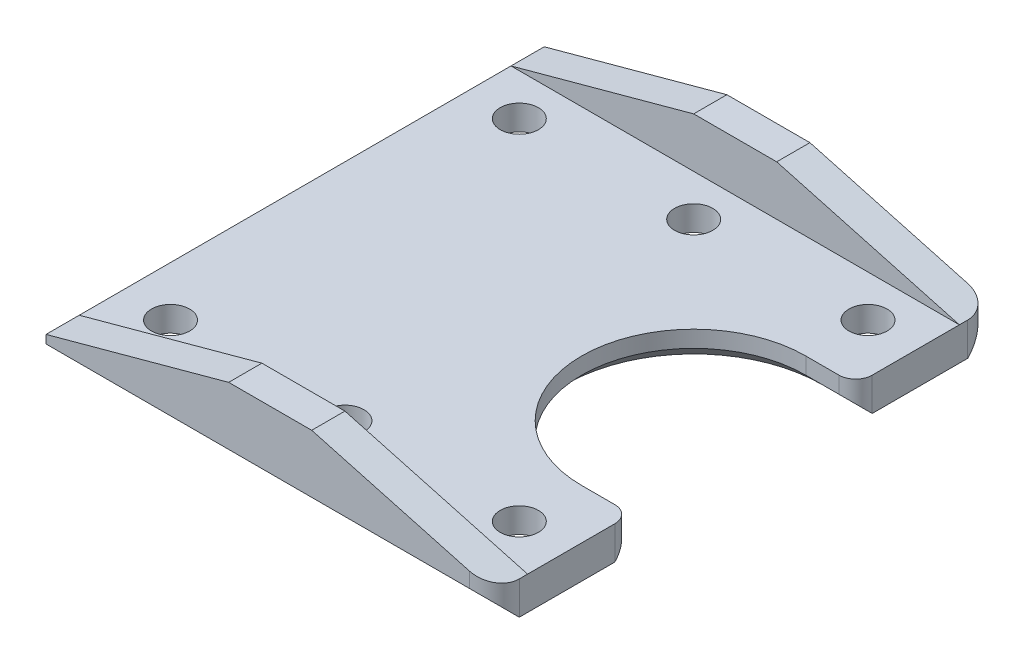
ISO-10303-21;
HEADER;
FILE_DESCRIPTION(('STEP AP214'),'2;1');
FILE_NAME('part.step','',(''),(''),'','','');
FILE_SCHEMA(('AUTOMOTIVE_DESIGN { 1 0 10303 214 1 1 1 1 }'));
ENDSEC;
DATA;
#1=APPLICATION_CONTEXT('core data for automotive mechanical design processes');
#2=APPLICATION_PROTOCOL_DEFINITION('international standard','automotive_design',2000,#1);
#3=PRODUCT_CONTEXT('',#1,'mechanical');
#4=PRODUCT('Part','Part','',(#3));
#5=PRODUCT_RELATED_PRODUCT_CATEGORY('part','',(#4));
#6=PRODUCT_DEFINITION_FORMATION('','',#4);
#7=PRODUCT_DEFINITION_CONTEXT('part definition',#1,'design');
#8=PRODUCT_DEFINITION('design','',#6,#7);
#9=PRODUCT_DEFINITION_SHAPE('','',#8);
#10=(LENGTH_UNIT() NAMED_UNIT(*) SI_UNIT(.MILLI.,.METRE.));
#11=(NAMED_UNIT(*) PLANE_ANGLE_UNIT() SI_UNIT($,.RADIAN.));
#12=(NAMED_UNIT(*) SI_UNIT($,.STERADIAN.) SOLID_ANGLE_UNIT());
#13=UNCERTAINTY_MEASURE_WITH_UNIT(LENGTH_MEASURE(1.E-05),#10,'distance_accuracy_value','');
#14=(GEOMETRIC_REPRESENTATION_CONTEXT(3) GLOBAL_UNCERTAINTY_ASSIGNED_CONTEXT((#13)) GLOBAL_UNIT_ASSIGNED_CONTEXT((#10,
#11,#12)) REPRESENTATION_CONTEXT('',''));
#15=CARTESIAN_POINT('',(0.,0.,0.));
#16=DIRECTION('',(0.,0.,1.));
#17=DIRECTION('',(1.,0.,0.));
#18=AXIS2_PLACEMENT_3D('',#15,#16,#17);
#19=CARTESIAN_POINT('',(27.,0.,15.));
#20=DIRECTION('',(0.,1.,0.));
#21=DIRECTION('',(0.,0.,1.));
#22=AXIS2_PLACEMENT_3D('',#19,#20,#21);
#23=PLANE('',#22);
#24=CARTESIAN_POINT('',(3.,0.,-10.5));
#25=DIRECTION('',(0.,-1.,0.));
#26=DIRECTION('',(0.,0.,-1.));
#27=AXIS2_PLACEMENT_3D('',#24,#25,#26);
#28=CIRCLE('',#27,1.9);
#29=CARTESIAN_POINT('',(3.,0.,-12.4));
#30=VERTEX_POINT('',#29);
#31=EDGE_CURVE('E255',#30,#30,#28,.T.);
#32=ORIENTED_EDGE('',*,*,#31,.F.);
#33=EDGE_LOOP('',(#32));
#34=FACE_BOUND('',#33,.T.);
#35=CARTESIAN_POINT('',(13.5,0.,-10.5));
#36=DIRECTION('',(0.,-1.,0.));
#37=DIRECTION('',(0.,0.,-1.));
#38=AXIS2_PLACEMENT_3D('',#35,#36,#37);
#39=CIRCLE('',#38,1.9);
#40=CARTESIAN_POINT('',(13.5,0.,-12.4));
#41=VERTEX_POINT('',#40);
#42=EDGE_CURVE('E268',#41,#41,#39,.T.);
#43=ORIENTED_EDGE('',*,*,#42,.F.);
#44=EDGE_LOOP('',(#43));
#45=FACE_BOUND('',#44,.T.);
#46=CARTESIAN_POINT('',(24.,0.,-10.5));
#47=DIRECTION('',(0.,-1.,0.));
#48=DIRECTION('',(0.,0.,-1.));
#49=AXIS2_PLACEMENT_3D('',#46,#47,#48);
#50=CIRCLE('',#49,1.9);
#51=CARTESIAN_POINT('',(24.,0.,-12.4));
#52=VERTEX_POINT('',#51);
#53=EDGE_CURVE('E280',#52,#52,#50,.T.);
#54=ORIENTED_EDGE('',*,*,#53,.F.);
#55=EDGE_LOOP('',(#54));
#56=FACE_BOUND('',#55,.T.);
#57=CARTESIAN_POINT('',(3.,0.,10.5));
#58=DIRECTION('',(0.,-1.,0.));
#59=DIRECTION('',(0.,0.,-1.));
#60=AXIS2_PLACEMENT_3D('',#57,#58,#59);
#61=CIRCLE('',#60,1.9);
#62=CARTESIAN_POINT('',(3.,0.,8.6));
#63=VERTEX_POINT('',#62);
#64=EDGE_CURVE('E354',#63,#63,#61,.T.);
#65=ORIENTED_EDGE('',*,*,#64,.F.);
#66=EDGE_LOOP('',(#65));
#67=FACE_BOUND('',#66,.T.);
#68=CARTESIAN_POINT('',(24.,0.,10.5));
#69=DIRECTION('',(0.,-1.,0.));
#70=DIRECTION('',(0.,0.,-1.));
#71=AXIS2_PLACEMENT_3D('',#68,#69,#70);
#72=CIRCLE('',#71,1.9);
#73=CARTESIAN_POINT('',(24.,0.,8.6));
#74=VERTEX_POINT('',#73);
#75=EDGE_CURVE('E304',#74,#74,#72,.T.);
#76=ORIENTED_EDGE('',*,*,#75,.F.);
#77=EDGE_LOOP('',(#76));
#78=FACE_BOUND('',#77,.T.);
#79=CARTESIAN_POINT('',(13.5,0.,10.5));
#80=DIRECTION('',(0.,-1.,0.));
#81=DIRECTION('',(0.,0.,-1.));
#82=AXIS2_PLACEMENT_3D('',#79,#80,#81);
#83=CIRCLE('',#82,1.9);
#84=CARTESIAN_POINT('',(13.5,0.,8.6));
#85=VERTEX_POINT('',#84);
#86=EDGE_CURVE('E292',#85,#85,#83,.T.);
#87=ORIENTED_EDGE('',*,*,#86,.F.);
#88=EDGE_LOOP('',(#87));
#89=FACE_BOUND('',#88,.T.);
#90=DIRECTION('',(0.,0.,1.));
#91=VECTOR('',#90,1.);
#92=CARTESIAN_POINT('',(0.,0.,-15.));
#93=LINE('',#92,#91);
#94=CARTESIAN_POINT('',(0.,0.,-13.5));
#95=VERTEX_POINT('',#94);
#96=CARTESIAN_POINT('',(0.,0.,13.5));
#97=VERTEX_POINT('',#96);
#98=EDGE_CURVE('E225',#95,#97,#93,.T.);
#99=ORIENTED_EDGE('',*,*,#98,.F.);
#100=DIRECTION('',(1.,0.,0.));
#101=VECTOR('',#100,1.);
#102=CARTESIAN_POINT('',(27.,0.,-13.5));
#103=LINE('',#102,#101);
#104=CARTESIAN_POINT('',(27.,0.,-13.5));
#105=VERTEX_POINT('',#104);
#106=EDGE_CURVE('E416',#95,#105,#103,.T.);
#107=ORIENTED_EDGE('',*,*,#106,.T.);
#108=DIRECTION('',(0.,0.,-1.));
#109=VECTOR('',#108,1.);
#110=CARTESIAN_POINT('',(27.,0.,15.));
#111=LINE('',#110,#109);
#112=CARTESIAN_POINT('',(27.,0.,-7.75000000000001));
#113=VERTEX_POINT('',#112);
#114=EDGE_CURVE('E327',#113,#105,#111,.T.);
#115=ORIENTED_EDGE('',*,*,#114,.F.);
#116=DIRECTION('',(-1.,0.,0.));
#117=VECTOR('',#116,1.);
#118=CARTESIAN_POINT('',(27.,0.,-7.75000000000001));
#119=LINE('',#118,#117);
#120=CARTESIAN_POINT('',(24.,0.,-7.75000000000001));
#121=VERTEX_POINT('',#120);
#122=EDGE_CURVE('E370',#113,#121,#119,.T.);
#123=ORIENTED_EDGE('',*,*,#122,.T.);
#124=CARTESIAN_POINT('',(24.,0.,0.));
#125=DIRECTION('',(0.,1.,0.));
#126=DIRECTION('',(0.,0.,1.));
#127=AXIS2_PLACEMENT_3D('',#124,#125,#126);
#128=CIRCLE('',#127,7.75000000000001);
#129=CARTESIAN_POINT('',(24.,0.,7.75000000000001));
#130=VERTEX_POINT('',#129);
#131=EDGE_CURVE('E368',#121,#130,#128,.T.);
#132=ORIENTED_EDGE('',*,*,#131,.T.);
#133=DIRECTION('',(1.,0.,0.));
#134=VECTOR('',#133,1.);
#135=CARTESIAN_POINT('',(27.,0.,7.75000000000001));
#136=LINE('',#135,#134);
#137=CARTESIAN_POINT('',(27.,0.,7.75000000000001));
#138=VERTEX_POINT('',#137);
#139=EDGE_CURVE('E372',#130,#138,#136,.T.);
#140=ORIENTED_EDGE('',*,*,#139,.T.);
#141=CARTESIAN_POINT('',(27.,0.,13.5));
#142=VERTEX_POINT('',#141);
#143=EDGE_CURVE('E330',#142,#138,#111,.T.);
#144=ORIENTED_EDGE('',*,*,#143,.F.);
#145=DIRECTION('',(-1.,0.,0.));
#146=VECTOR('',#145,1.);
#147=CARTESIAN_POINT('',(27.,0.,13.5));
#148=LINE('',#147,#146);
#149=EDGE_CURVE('E413',#142,#97,#148,.T.);
#150=ORIENTED_EDGE('',*,*,#149,.T.);
#151=EDGE_LOOP('',(#99,#107,#115,#123,#132,#140,#144,#150));
#152=FACE_BOUND('',#151,.T.);
#153=ADVANCED_FACE('F54',(#34,#45,#56,#67,#78,#89,#152),#23,.F.);
#154=CARTESIAN_POINT('',(27.,5.,15.));
#155=DIRECTION('',(0.,0.,-1.));
#156=DIRECTION('',(0.,1.,0.));
#157=AXIS2_PLACEMENT_3D('',#154,#155,#156);
#158=PLANE('',#157);
#159=DIRECTION('',(0.,-1.,0.));
#160=VECTOR('',#159,1.);
#161=CARTESIAN_POINT('',(0.,0.,15.));
#162=LINE('',#161,#160);
#163=CARTESIAN_POINT('',(0.,2.,15.));
#164=VERTEX_POINT('',#163);
#165=CARTESIAN_POINT('',(0.,1.50000000000001,15.));
#166=VERTEX_POINT('',#165);
#167=EDGE_CURVE('E220',#164,#166,#162,.T.);
#168=ORIENTED_EDGE('',*,*,#167,.T.);
#169=DIRECTION('',(1.,0.,0.));
#170=VECTOR('',#169,1.);
#171=CARTESIAN_POINT('',(27.,1.50000000000001,15.));
#172=LINE('',#171,#170);
#173=CARTESIAN_POINT('',(25.5,1.50000000000001,15.));
#174=VERTEX_POINT('',#173);
#175=EDGE_CURVE('E421',#166,#174,#172,.T.);
#176=ORIENTED_EDGE('',*,*,#175,.T.);
#177=DIRECTION('',(0.,-1.,0.));
#178=VECTOR('',#177,1.);
#179=CARTESIAN_POINT('',(25.5,5.,15.));
#180=LINE('',#179,#178);
#181=CARTESIAN_POINT('',(25.5,2.40909090909091,15.));
#182=VERTEX_POINT('',#181);
#183=EDGE_CURVE('E386',#174,#182,#180,.F.);
#184=ORIENTED_EDGE('',*,*,#183,.T.);
#185=DIRECTION('',(0.964763821237732,-0.263117405792109,0.));
#186=VECTOR('',#185,1.);
#187=CARTESIAN_POINT('',(16.,5.,15.));
#188=LINE('',#187,#186);
#189=CARTESIAN_POINT('',(16.,5.,15.));
#190=VERTEX_POINT('',#189);
#191=EDGE_CURVE('E77',#190,#182,#188,.T.);
#192=ORIENTED_EDGE('',*,*,#191,.F.);
#193=DIRECTION('',(-1.,0.,0.));
#194=VECTOR('',#193,1.);
#195=CARTESIAN_POINT('',(27.,5.,15.));
#196=LINE('',#195,#194);
#197=CARTESIAN_POINT('',(11.,5.,15.));
#198=VERTEX_POINT('',#197);
#199=EDGE_CURVE('E337',#190,#198,#196,.T.);
#200=ORIENTED_EDGE('',*,*,#199,.T.);
#201=DIRECTION('',(-0.964763821237732,-0.263117405792109,0.));
#202=VECTOR('',#201,1.);
#203=CARTESIAN_POINT('',(-0.507692307692307,1.86153846153846,15.));
#204=LINE('',#203,#202);
#205=EDGE_CURVE('E217',#198,#164,#204,.T.);
#206=ORIENTED_EDGE('',*,*,#205,.T.);
#207=EDGE_LOOP('',(#168,#176,#184,#192,#200,#206));
#208=FACE_BOUND('',#207,.T.);
#209=ADVANCED_FACE('F439',(#208),#158,.F.);
#210=CARTESIAN_POINT('',(27.,0.,-15.));
#211=DIRECTION('',(0.,0.,1.));
#212=DIRECTION('',(0.,-1.,0.));
#213=AXIS2_PLACEMENT_3D('',#210,#211,#212);
#214=PLANE('',#213);
#215=DIRECTION('',(0.,-1.,0.));
#216=VECTOR('',#215,1.);
#217=CARTESIAN_POINT('',(0.,0.,-15.));
#218=LINE('',#217,#216);
#219=CARTESIAN_POINT('',(0.,2.,-15.));
#220=VERTEX_POINT('',#219);
#221=CARTESIAN_POINT('',(0.,1.50000000000001,-15.));
#222=VERTEX_POINT('',#221);
#223=EDGE_CURVE('E203',#220,#222,#218,.T.);
#224=ORIENTED_EDGE('',*,*,#223,.F.);
#225=DIRECTION('',(-0.964763821237732,-0.263117405792109,0.));
#226=VECTOR('',#225,1.);
#227=CARTESIAN_POINT('',(-0.507692307692307,1.86153846153846,-15.));
#228=LINE('',#227,#226);
#229=CARTESIAN_POINT('',(11.,5.,-15.));
#230=VERTEX_POINT('',#229);
#231=EDGE_CURVE('E191',#230,#220,#228,.T.);
#232=ORIENTED_EDGE('',*,*,#231,.F.);
#233=DIRECTION('',(-1.,0.,0.));
#234=VECTOR('',#233,1.);
#235=CARTESIAN_POINT('',(27.,5.,-15.));
#236=LINE('',#235,#234);
#237=CARTESIAN_POINT('',(16.,5.,-15.));
#238=VERTEX_POINT('',#237);
#239=EDGE_CURVE('E352',#238,#230,#236,.T.);
#240=ORIENTED_EDGE('',*,*,#239,.F.);
#241=DIRECTION('',(0.964763821237732,-0.263117405792109,0.));
#242=VECTOR('',#241,1.);
#243=CARTESIAN_POINT('',(16.,5.,-15.));
#244=LINE('',#243,#242);
#245=CARTESIAN_POINT('',(25.5,2.40909090909091,-15.));
#246=VERTEX_POINT('',#245);
#247=EDGE_CURVE('E234',#238,#246,#244,.T.);
#248=ORIENTED_EDGE('',*,*,#247,.T.);
#249=DIRECTION('',(0.,1.,0.));
#250=VECTOR('',#249,1.);
#251=CARTESIAN_POINT('',(25.5,0.,-15.));
#252=LINE('',#251,#250);
#253=CARTESIAN_POINT('',(25.5,1.50000000000001,-15.));
#254=VERTEX_POINT('',#253);
#255=EDGE_CURVE('E380',#246,#254,#252,.F.);
#256=ORIENTED_EDGE('',*,*,#255,.T.);
#257=DIRECTION('',(-1.,0.,0.));
#258=VECTOR('',#257,1.);
#259=CARTESIAN_POINT('',(27.,1.50000000000001,-15.));
#260=LINE('',#259,#258);
#261=EDGE_CURVE('E216',#254,#222,#260,.T.);
#262=ORIENTED_EDGE('',*,*,#261,.T.);
#263=EDGE_LOOP('',(#224,#232,#240,#248,#256,#262));
#264=FACE_BOUND('',#263,.T.);
#265=ADVANCED_FACE('F214',(#264),#214,.F.);
#266=CARTESIAN_POINT('',(27.,5.,-15.));
#267=DIRECTION('',(0.,-1.,0.));
#268=DIRECTION('',(0.,0.,-1.));
#269=AXIS2_PLACEMENT_3D('',#266,#267,#268);
#270=PLANE('',#269);
#271=DIRECTION('',(0.,0.,1.));
#272=VECTOR('',#271,1.);
#273=CARTESIAN_POINT('',(11.,5.,-15.));
#274=LINE('',#273,#272);
#275=CARTESIAN_POINT('',(11.,5.,-13.));
#276=VERTEX_POINT('',#275);
#277=EDGE_CURVE('E197',#230,#276,#274,.T.);
#278=ORIENTED_EDGE('',*,*,#277,.T.);
#279=DIRECTION('',(-1.,0.,0.));
#280=VECTOR('',#279,1.);
#281=CARTESIAN_POINT('',(27.,5.,-13.));
#282=LINE('',#281,#280);
#283=CARTESIAN_POINT('',(16.,5.,-13.));
#284=VERTEX_POINT('',#283);
#285=EDGE_CURVE('E349',#284,#276,#282,.T.);
#286=ORIENTED_EDGE('',*,*,#285,.F.);
#287=DIRECTION('',(0.,0.,1.));
#288=VECTOR('',#287,1.);
#289=CARTESIAN_POINT('',(16.,5.,-15.));
#290=LINE('',#289,#288);
#291=EDGE_CURVE('E232',#238,#284,#290,.T.);
#292=ORIENTED_EDGE('',*,*,#291,.F.);
#293=ORIENTED_EDGE('',*,*,#239,.T.);
#294=EDGE_LOOP('',(#278,#286,#292,#293));
#295=FACE_BOUND('',#294,.T.);
#296=ADVANCED_FACE('F462',(#295),#270,.F.);
#297=CARTESIAN_POINT('',(27.,5.,-13.));
#298=DIRECTION('',(0.,0.,-1.));
#299=DIRECTION('',(-1.,0.,0.));
#300=AXIS2_PLACEMENT_3D('',#297,#298,#299);
#301=PLANE('',#300);
#302=DIRECTION('',(0.964763821237732,0.263117405792109,0.));
#303=VECTOR('',#302,1.);
#304=CARTESIAN_POINT('',(25.8923076923077,9.06153846153845,-13.));
#305=LINE('',#304,#303);
#306=CARTESIAN_POINT('',(0.,2.,-13.));
#307=VERTEX_POINT('',#306);
#308=EDGE_CURVE('E252',#307,#276,#305,.T.);
#309=ORIENTED_EDGE('',*,*,#308,.F.);
#310=DIRECTION('',(-1.,0.,0.));
#311=VECTOR('',#310,1.);
#312=CARTESIAN_POINT('',(27.,2.,-13.));
#313=LINE('',#312,#311);
#314=CARTESIAN_POINT('',(27.,2.,-13.));
#315=VERTEX_POINT('',#314);
#316=EDGE_CURVE('E346',#315,#307,#313,.T.);
#317=ORIENTED_EDGE('',*,*,#316,.F.);
#318=DIRECTION('',(-0.964763821237732,0.263117405792109,0.));
#319=VECTOR('',#318,1.);
#320=CARTESIAN_POINT('',(26.2384615384615,2.20769230769231,-13.));
#321=LINE('',#320,#319);
#322=EDGE_CURVE('E247',#315,#284,#321,.T.);
#323=ORIENTED_EDGE('',*,*,#322,.T.);
#324=ORIENTED_EDGE('',*,*,#285,.T.);
#325=EDGE_LOOP('',(#309,#317,#323,#324));
#326=FACE_BOUND('',#325,.T.);
#327=ADVANCED_FACE('F459',(#326),#301,.F.);
#328=CARTESIAN_POINT('',(27.,2.,-13.));
#329=DIRECTION('',(0.,-1.,0.));
#330=DIRECTION('',(0.,0.,-1.));
#331=AXIS2_PLACEMENT_3D('',#328,#329,#330);
#332=PLANE('',#331);
#333=CARTESIAN_POINT('',(3.,2.,10.5));
#334=DIRECTION('',(0.,-1.,0.));
#335=DIRECTION('',(0.,0.,-1.));
#336=AXIS2_PLACEMENT_3D('',#333,#334,#335);
#337=CIRCLE('',#336,1.15);
#338=CARTESIAN_POINT('',(3.,2.,9.35));
#339=VERTEX_POINT('',#338);
#340=EDGE_CURVE('E357',#339,#339,#337,.T.);
#341=ORIENTED_EDGE('',*,*,#340,.T.);
#342=EDGE_LOOP('',(#341));
#343=FACE_BOUND('',#342,.T.);
#344=CARTESIAN_POINT('',(24.,2.,10.5));
#345=DIRECTION('',(0.,-1.,0.));
#346=DIRECTION('',(0.,0.,-1.));
#347=AXIS2_PLACEMENT_3D('',#344,#345,#346);
#348=CIRCLE('',#347,1.15);
#349=CARTESIAN_POINT('',(24.,2.,9.35));
#350=VERTEX_POINT('',#349);
#351=EDGE_CURVE('E313',#350,#350,#348,.T.);
#352=ORIENTED_EDGE('',*,*,#351,.T.);
#353=EDGE_LOOP('',(#352));
#354=FACE_BOUND('',#353,.T.);
#355=CARTESIAN_POINT('',(13.5,2.,10.5));
#356=DIRECTION('',(0.,-1.,0.));
#357=DIRECTION('',(0.,0.,-1.));
#358=AXIS2_PLACEMENT_3D('',#355,#356,#357);
#359=CIRCLE('',#358,1.15);
#360=CARTESIAN_POINT('',(13.5,2.,9.35));
#361=VERTEX_POINT('',#360);
#362=EDGE_CURVE('E295',#361,#361,#359,.T.);
#363=ORIENTED_EDGE('',*,*,#362,.T.);
#364=EDGE_LOOP('',(#363));
#365=FACE_BOUND('',#364,.T.);
#366=CARTESIAN_POINT('',(24.,2.,-10.5));
#367=DIRECTION('',(0.,-1.,0.));
#368=DIRECTION('',(0.,0.,-1.));
#369=AXIS2_PLACEMENT_3D('',#366,#367,#368);
#370=CIRCLE('',#369,1.15);
#371=CARTESIAN_POINT('',(24.,2.,-11.65));
#372=VERTEX_POINT('',#371);
#373=EDGE_CURVE('E289',#372,#372,#370,.T.);
#374=ORIENTED_EDGE('',*,*,#373,.T.);
#375=EDGE_LOOP('',(#374));
#376=FACE_BOUND('',#375,.T.);
#377=CARTESIAN_POINT('',(13.5,2.,-10.5));
#378=DIRECTION('',(0.,-1.,0.));
#379=DIRECTION('',(0.,0.,-1.));
#380=AXIS2_PLACEMENT_3D('',#377,#378,#379);
#381=CIRCLE('',#380,1.15);
#382=CARTESIAN_POINT('',(13.5,2.,-11.65));
#383=VERTEX_POINT('',#382);
#384=EDGE_CURVE('E277',#383,#383,#381,.T.);
#385=ORIENTED_EDGE('',*,*,#384,.T.);
#386=EDGE_LOOP('',(#385));
#387=FACE_BOUND('',#386,.T.);
#388=CARTESIAN_POINT('',(3.,2.,-10.5));
#389=DIRECTION('',(0.,-1.,0.));
#390=DIRECTION('',(0.,0.,-1.));
#391=AXIS2_PLACEMENT_3D('',#388,#389,#390);
#392=CIRCLE('',#391,1.15);
#393=CARTESIAN_POINT('',(3.,2.,-11.65));
#394=VERTEX_POINT('',#393);
#395=EDGE_CURVE('E265',#394,#394,#392,.T.);
#396=ORIENTED_EDGE('',*,*,#395,.T.);
#397=EDGE_LOOP('',(#396));
#398=FACE_BOUND('',#397,.T.);
#399=DIRECTION('',(0.,0.,1.));
#400=VECTOR('',#399,1.);
#401=CARTESIAN_POINT('',(0.,2.,-15.));
#402=LINE('',#401,#400);
#403=CARTESIAN_POINT('',(0.,2.,13.));
#404=VERTEX_POINT('',#403);
#405=EDGE_CURVE('E210',#307,#404,#402,.T.);
#406=ORIENTED_EDGE('',*,*,#405,.T.);
#407=DIRECTION('',(-1.,0.,0.));
#408=VECTOR('',#407,1.);
#409=CARTESIAN_POINT('',(27.,2.,13.));
#410=LINE('',#409,#408);
#411=CARTESIAN_POINT('',(27.,2.,13.));
#412=VERTEX_POINT('',#411);
#413=EDGE_CURVE('E343',#412,#404,#410,.T.);
#414=ORIENTED_EDGE('',*,*,#413,.F.);
#415=DIRECTION('',(0.,0.,1.));
#416=VECTOR('',#415,1.);
#417=CARTESIAN_POINT('',(27.,2.,-13.));
#418=LINE('',#417,#416);
#419=CARTESIAN_POINT('',(27.,2.,7.74999999999999));
#420=VERTEX_POINT('',#419);
#421=EDGE_CURVE('E333',#420,#412,#418,.T.);
#422=ORIENTED_EDGE('',*,*,#421,.F.);
#423=CARTESIAN_POINT('',(26.,2.,7.75));
#424=DIRECTION('',(0.,-1.,0.));
#425=DIRECTION('',(0.,0.,-1.));
#426=AXIS2_PLACEMENT_3D('',#423,#424,#425);
#427=CIRCLE('',#426,1.);
#428=CARTESIAN_POINT('',(26.,2.,6.75));
#429=VERTEX_POINT('',#428);
#430=EDGE_CURVE('E394',#420,#429,#427,.F.);
#431=ORIENTED_EDGE('',*,*,#430,.T.);
#432=DIRECTION('',(1.,0.,0.));
#433=VECTOR('',#432,1.);
#434=CARTESIAN_POINT('',(28.,2.,6.75));
#435=LINE('',#434,#433);
#436=CARTESIAN_POINT('',(24.,2.,6.75));
#437=VERTEX_POINT('',#436);
#438=EDGE_CURVE('E316',#437,#429,#435,.T.);
#439=ORIENTED_EDGE('',*,*,#438,.F.);
#440=CARTESIAN_POINT('',(24.,2.,0.));
#441=DIRECTION('',(0.,1.,0.));
#442=DIRECTION('',(0.,0.,1.));
#443=AXIS2_PLACEMENT_3D('',#440,#441,#442);
#444=CIRCLE('',#443,6.75);
#445=CARTESIAN_POINT('',(24.,2.,-6.75));
#446=VERTEX_POINT('',#445);
#447=EDGE_CURVE('E321',#446,#437,#444,.T.);
#448=ORIENTED_EDGE('',*,*,#447,.F.);
#449=DIRECTION('',(-1.,0.,0.));
#450=VECTOR('',#449,1.);
#451=CARTESIAN_POINT('',(24.,2.,-6.75));
#452=LINE('',#451,#450);
#453=CARTESIAN_POINT('',(26.,2.,-6.75));
#454=VERTEX_POINT('',#453);
#455=EDGE_CURVE('E319',#454,#446,#452,.T.);
#456=ORIENTED_EDGE('',*,*,#455,.F.);
#457=CARTESIAN_POINT('',(26.,2.,-7.75));
#458=DIRECTION('',(0.,-1.,0.));
#459=DIRECTION('',(0.,0.,-1.));
#460=AXIS2_PLACEMENT_3D('',#457,#458,#459);
#461=CIRCLE('',#460,1.);
#462=CARTESIAN_POINT('',(27.,2.,-7.75));
#463=VERTEX_POINT('',#462);
#464=EDGE_CURVE('E396',#454,#463,#461,.F.);
#465=ORIENTED_EDGE('',*,*,#464,.T.);
#466=EDGE_CURVE('E334',#315,#463,#418,.T.);
#467=ORIENTED_EDGE('',*,*,#466,.F.);
#468=ORIENTED_EDGE('',*,*,#316,.T.);
#469=EDGE_LOOP('',(#406,#414,#422,#431,#439,#448,#456,#465,#467,#468));
#470=FACE_BOUND('',#469,.T.);
#471=ADVANCED_FACE('F454',(#343,#354,#365,#376,#387,#398,#470),#332,.F.);
#472=CARTESIAN_POINT('',(27.,2.,13.));
#473=DIRECTION('',(0.,0.,1.));
#474=DIRECTION('',(1.,0.,0.));
#475=AXIS2_PLACEMENT_3D('',#472,#473,#474);
#476=PLANE('',#475);
#477=DIRECTION('',(-0.964763821237732,-0.263117405792109,0.));
#478=VECTOR('',#477,1.);
#479=CARTESIAN_POINT('',(25.1307692307692,8.85384615384615,13.));
#480=LINE('',#479,#478);
#481=CARTESIAN_POINT('',(11.,5.,13.));
#482=VERTEX_POINT('',#481);
#483=EDGE_CURVE('E250',#482,#404,#480,.T.);
#484=ORIENTED_EDGE('',*,*,#483,.F.);
#485=DIRECTION('',(-1.,0.,0.));
#486=VECTOR('',#485,1.);
#487=CARTESIAN_POINT('',(27.,5.,13.));
#488=LINE('',#487,#486);
#489=CARTESIAN_POINT('',(16.,5.,13.));
#490=VERTEX_POINT('',#489);
#491=EDGE_CURVE('E340',#490,#482,#488,.T.);
#492=ORIENTED_EDGE('',*,*,#491,.F.);
#493=DIRECTION('',(0.964763821237732,-0.263117405792109,0.));
#494=VECTOR('',#493,1.);
#495=CARTESIAN_POINT('',(27.,2.,13.));
#496=LINE('',#495,#494);
#497=EDGE_CURVE('E244',#490,#412,#496,.T.);
#498=ORIENTED_EDGE('',*,*,#497,.T.);
#499=ORIENTED_EDGE('',*,*,#413,.T.);
#500=EDGE_LOOP('',(#484,#492,#498,#499));
#501=FACE_BOUND('',#500,.T.);
#502=ADVANCED_FACE('F450',(#501),#476,.F.);
#503=CARTESIAN_POINT('',(27.,5.,13.));
#504=DIRECTION('',(0.,-1.,0.));
#505=DIRECTION('',(0.,0.,-1.));
#506=AXIS2_PLACEMENT_3D('',#503,#504,#505);
#507=PLANE('',#506);
#508=EDGE_CURVE('E211',#482,#198,#274,.T.);
#509=ORIENTED_EDGE('',*,*,#508,.T.);
#510=ORIENTED_EDGE('',*,*,#199,.F.);
#511=EDGE_CURVE('E238',#490,#190,#290,.T.);
#512=ORIENTED_EDGE('',*,*,#511,.F.);
#513=ORIENTED_EDGE('',*,*,#491,.T.);
#514=EDGE_LOOP('',(#509,#510,#512,#513));
#515=FACE_BOUND('',#514,.T.);
#516=ADVANCED_FACE('F446',(#515),#507,.F.);
#517=CARTESIAN_POINT('',(27.,1.50000000000001,-15.));
#518=DIRECTION('',(0.,0.707106781186549,0.707106781186546));
#519=DIRECTION('',(-1.,0.,0.));
#520=AXIS2_PLACEMENT_3D('',#517,#518,#519);
#521=PLANE('',#520);
#522=ORIENTED_EDGE('',*,*,#106,.F.);
#523=DIRECTION('',(0.,-0.707106781186546,0.707106781186549));
#524=VECTOR('',#523,1.);
#525=CARTESIAN_POINT('',(0.,1.5,-15.));
#526=LINE('',#525,#524);
#527=EDGE_CURVE('E227',#95,#222,#526,.F.);
#528=ORIENTED_EDGE('',*,*,#527,.T.);
#529=ORIENTED_EDGE('',*,*,#261,.F.);
#530=CARTESIAN_POINT('',(25.5,0.,-13.5));
#531=DIRECTION('',(0.,0.707106781186549,0.707106781186546));
#532=DIRECTION('',(0.,-0.707106781186546,0.707106781186549));
#533=AXIS2_PLACEMENT_3D('',#530,#531,#532);
#534=ELLIPSE('',#533,2.12132034355964,1.5);
#535=EDGE_CURVE('E418',#105,#254,#534,.T.);
#536=ORIENTED_EDGE('',*,*,#535,.F.);
#537=EDGE_LOOP('',(#522,#528,#529,#536));
#538=FACE_BOUND('',#537,.T.);
#539=ADVANCED_FACE('F471',(#538),#521,.F.);
#540=CARTESIAN_POINT('',(27.,0.,13.5));
#541=DIRECTION('',(0.,0.707106781186546,-0.707106781186549));
#542=DIRECTION('',(-1.,0.,0.));
#543=AXIS2_PLACEMENT_3D('',#540,#541,#542);
#544=PLANE('',#543);
#545=ORIENTED_EDGE('',*,*,#175,.F.);
#546=DIRECTION('',(0.,0.707106781186549,0.707106781186546));
#547=VECTOR('',#546,1.);
#548=CARTESIAN_POINT('',(0.,0.,13.5));
#549=LINE('',#548,#547);
#550=EDGE_CURVE('E12',#166,#97,#549,.F.);
#551=ORIENTED_EDGE('',*,*,#550,.T.);
#552=ORIENTED_EDGE('',*,*,#149,.F.);
#553=CARTESIAN_POINT('',(25.5,0.,13.5));
#554=DIRECTION('',(0.,0.707106781186546,-0.707106781186549));
#555=DIRECTION('',(0.,0.707106781186549,0.707106781186546));
#556=AXIS2_PLACEMENT_3D('',#553,#554,#555);
#557=ELLIPSE('',#556,2.12132034355965,1.5);
#558=EDGE_CURVE('E62',#174,#142,#557,.T.);
#559=ORIENTED_EDGE('',*,*,#558,.F.);
#560=EDGE_LOOP('',(#545,#551,#552,#559));
#561=FACE_BOUND('',#560,.T.);
#562=ADVANCED_FACE('F56',(#561),#544,.F.);
#563=CARTESIAN_POINT('',(3.,0.,10.5));
#564=DIRECTION('',(0.,-1.,0.));
#565=DIRECTION('',(0.,0.,-1.));
#566=AXIS2_PLACEMENT_3D('',#563,#564,#565);
#567=CYLINDRICAL_SURFACE('',#566,1.9);
#568=CARTESIAN_POINT('',(3.,0.499999999999998,10.5));
#569=DIRECTION('',(0.,-1.,0.));
#570=DIRECTION('',(0.,0.,-1.));
#571=AXIS2_PLACEMENT_3D('',#568,#569,#570);
#572=CIRCLE('',#571,1.9);
#573=CARTESIAN_POINT('',(3.,0.499999999999998,8.6));
#574=VERTEX_POINT('',#573);
#575=EDGE_CURVE('E363',#574,#574,#572,.T.);
#576=ORIENTED_EDGE('',*,*,#575,.F.);
#577=EDGE_LOOP('',(#576));
#578=FACE_BOUND('',#577,.T.);
#579=ORIENTED_EDGE('',*,*,#64,.T.);
#580=EDGE_LOOP('',(#579));
#581=FACE_BOUND('',#580,.T.);
#582=ADVANCED_FACE('F538',(#578,#581),#567,.F.);
#583=CARTESIAN_POINT('',(4.15,0.499999999999998,10.5));
#584=DIRECTION('',(0.,1.,0.));
#585=DIRECTION('',(0.,0.,1.));
#586=AXIS2_PLACEMENT_3D('',#583,#584,#585);
#587=PLANE('',#586);
#588=CARTESIAN_POINT('',(3.,0.499999999999998,10.5));
#589=DIRECTION('',(0.,-1.,0.));
#590=DIRECTION('',(0.,0.,-1.));
#591=AXIS2_PLACEMENT_3D('',#588,#589,#590);
#592=CIRCLE('',#591,1.15);
#593=CARTESIAN_POINT('',(3.,0.499999999999998,9.35));
#594=VERTEX_POINT('',#593);
#595=EDGE_CURVE('E360',#594,#594,#592,.T.);
#596=ORIENTED_EDGE('',*,*,#595,.F.);
#597=EDGE_LOOP('',(#596));
#598=FACE_BOUND('',#597,.T.);
#599=ORIENTED_EDGE('',*,*,#575,.T.);
#600=EDGE_LOOP('',(#599));
#601=FACE_BOUND('',#600,.T.);
#602=ADVANCED_FACE('F534',(#598,#601),#587,.F.);
#603=CARTESIAN_POINT('',(3.,0.,10.5));
#604=DIRECTION('',(0.,-1.,0.));
#605=DIRECTION('',(0.,0.,-1.));
#606=AXIS2_PLACEMENT_3D('',#603,#604,#605);
#607=CYLINDRICAL_SURFACE('',#606,1.15);
#608=ORIENTED_EDGE('',*,*,#340,.F.);
#609=EDGE_LOOP('',(#608));
#610=FACE_BOUND('',#609,.T.);
#611=ORIENTED_EDGE('',*,*,#595,.T.);
#612=EDGE_LOOP('',(#611));
#613=FACE_BOUND('',#612,.T.);
#614=ADVANCED_FACE('F530',(#610,#613),#607,.F.);
#615=CARTESIAN_POINT('',(27.,0.,0.));
#616=DIRECTION('',(1.,0.,0.));
#617=DIRECTION('',(0.,0.,-1.));
#618=AXIS2_PLACEMENT_3D('',#615,#616,#617);
#619=PLANE('',#618);
#620=DIRECTION('',(0.,0.,1.));
#621=VECTOR('',#620,1.);
#622=CARTESIAN_POINT('',(27.,2.,-15.));
#623=LINE('',#622,#621);
#624=CARTESIAN_POINT('',(27.,2.,13.5));
#625=VERTEX_POINT('',#624);
#626=EDGE_CURVE('E229',#412,#625,#623,.T.);
#627=ORIENTED_EDGE('',*,*,#626,.T.);
#628=DIRECTION('',(0.,-1.,0.));
#629=VECTOR('',#628,1.);
#630=CARTESIAN_POINT('',(27.,0.,13.5));
#631=LINE('',#630,#629);
#632=EDGE_CURVE('E392',#625,#142,#631,.T.);
#633=ORIENTED_EDGE('',*,*,#632,.T.);
#634=ORIENTED_EDGE('',*,*,#143,.T.);
#635=DIRECTION('',(0.,1.,0.));
#636=VECTOR('',#635,1.);
#637=CARTESIAN_POINT('',(27.,2.,7.75));
#638=LINE('',#637,#636);
#639=EDGE_CURVE('E405',#138,#420,#638,.T.);
#640=ORIENTED_EDGE('',*,*,#639,.T.);
#641=ORIENTED_EDGE('',*,*,#421,.T.);
#642=EDGE_LOOP('',(#627,#633,#634,#640,#641));
#643=FACE_BOUND('',#642,.T.);
#644=ADVANCED_FACE('F533',(#643),#619,.T.);
#645=CARTESIAN_POINT('',(27.,2.,-13.5));
#646=VERTEX_POINT('',#645);
#647=EDGE_CURVE('E69',#646,#315,#623,.T.);
#648=ORIENTED_EDGE('',*,*,#647,.T.);
#649=ORIENTED_EDGE('',*,*,#466,.T.);
#650=DIRECTION('',(0.,-1.,0.));
#651=VECTOR('',#650,1.);
#652=CARTESIAN_POINT('',(27.,1.00000000000001,-7.75));
#653=LINE('',#652,#651);
#654=EDGE_CURVE('E398',#463,#113,#653,.T.);
#655=ORIENTED_EDGE('',*,*,#654,.T.);
#656=ORIENTED_EDGE('',*,*,#114,.T.);
#657=DIRECTION('',(0.,1.,0.));
#658=VECTOR('',#657,1.);
#659=CARTESIAN_POINT('',(27.,5.,-13.5));
#660=LINE('',#659,#658);
#661=EDGE_CURVE('E389',#105,#646,#660,.T.);
#662=ORIENTED_EDGE('',*,*,#661,.T.);
#663=EDGE_LOOP('',(#648,#649,#655,#656,#662));
#664=FACE_BOUND('',#663,.T.);
#665=ADVANCED_FACE('F476',(#664),#619,.T.);
#666=CARTESIAN_POINT('',(28.,-0.00100000000000013,6.75));
#667=DIRECTION('',(0.,0.,1.));
#668=DIRECTION('',(1.,0.,0.));
#669=AXIS2_PLACEMENT_3D('',#666,#667,#668);
#670=PLANE('',#669);
#671=ORIENTED_EDGE('',*,*,#438,.T.);
#672=DIRECTION('',(0.,1.,0.));
#673=VECTOR('',#672,1.);
#674=CARTESIAN_POINT('',(26.,1.,6.75));
#675=LINE('',#674,#673);
#676=CARTESIAN_POINT('',(26.,1.,6.75));
#677=VERTEX_POINT('',#676);
#678=EDGE_CURVE('E408',#429,#677,#675,.F.);
#679=ORIENTED_EDGE('',*,*,#678,.T.);
#680=DIRECTION('',(-1.,0.,0.));
#681=VECTOR('',#680,1.);
#682=CARTESIAN_POINT('',(28.,1.,6.75));
#683=LINE('',#682,#681);
#684=CARTESIAN_POINT('',(24.,1.,6.75));
#685=VERTEX_POINT('',#684);
#686=EDGE_CURVE('E366',#677,#685,#683,.T.);
#687=ORIENTED_EDGE('',*,*,#686,.T.);
#688=DIRECTION('',(0.,1.,0.));
#689=VECTOR('',#688,1.);
#690=CARTESIAN_POINT('',(24.,-0.00100000000000013,6.75));
#691=LINE('',#690,#689);
#692=EDGE_CURVE('E325',#685,#437,#691,.T.);
#693=ORIENTED_EDGE('',*,*,#692,.T.);
#694=EDGE_LOOP('',(#671,#679,#687,#693));
#695=FACE_BOUND('',#694,.T.);
#696=ADVANCED_FACE('F498',(#695),#670,.F.);
#697=CARTESIAN_POINT('',(24.,-0.00100000000000013,0.));
#698=DIRECTION('',(0.,1.,0.));
#699=DIRECTION('',(0.,0.,1.));
#700=AXIS2_PLACEMENT_3D('',#697,#698,#699);
#701=CYLINDRICAL_SURFACE('',#700,6.75);
#702=ORIENTED_EDGE('',*,*,#692,.F.);
#703=CARTESIAN_POINT('',(24.,1.,0.));
#704=DIRECTION('',(0.,1.,0.));
#705=DIRECTION('',(0.,0.,1.));
#706=AXIS2_PLACEMENT_3D('',#703,#704,#705);
#707=CIRCLE('',#706,6.75);
#708=CARTESIAN_POINT('',(24.,1.,-6.75));
#709=VERTEX_POINT('',#708);
#710=EDGE_CURVE('E378',#685,#709,#707,.F.);
#711=ORIENTED_EDGE('',*,*,#710,.T.);
#712=DIRECTION('',(0.,1.,0.));
#713=VECTOR('',#712,1.);
#714=CARTESIAN_POINT('',(24.,-0.00100000000000013,-6.75));
#715=LINE('',#714,#713);
#716=EDGE_CURVE('E324',#709,#446,#715,.T.);
#717=ORIENTED_EDGE('',*,*,#716,.T.);
#718=ORIENTED_EDGE('',*,*,#447,.T.);
#719=EDGE_LOOP('',(#702,#711,#717,#718));
#720=FACE_BOUND('',#719,.T.);
#721=ADVANCED_FACE('F493',(#720),#701,.F.);
#722=CARTESIAN_POINT('',(24.,-0.00100000000000013,-6.75));
#723=DIRECTION('',(0.,0.,-1.));
#724=DIRECTION('',(-1.,0.,0.));
#725=AXIS2_PLACEMENT_3D('',#722,#723,#724);
#726=PLANE('',#725);
#727=DIRECTION('',(1.,0.,0.));
#728=VECTOR('',#727,1.);
#729=CARTESIAN_POINT('',(24.,1.00000000000001,-6.75));
#730=LINE('',#729,#728);
#731=CARTESIAN_POINT('',(26.,1.00000000000001,-6.75));
#732=VERTEX_POINT('',#731);
#733=EDGE_CURVE('E375',#709,#732,#730,.T.);
#734=ORIENTED_EDGE('',*,*,#733,.T.);
#735=DIRECTION('',(0.,-1.,0.));
#736=VECTOR('',#735,1.);
#737=CARTESIAN_POINT('',(26.,2.,-6.75));
#738=LINE('',#737,#736);
#739=EDGE_CURVE('E403',#732,#454,#738,.F.);
#740=ORIENTED_EDGE('',*,*,#739,.T.);
#741=ORIENTED_EDGE('',*,*,#455,.T.);
#742=ORIENTED_EDGE('',*,*,#716,.F.);
#743=EDGE_LOOP('',(#734,#740,#741,#742));
#744=FACE_BOUND('',#743,.T.);
#745=ADVANCED_FACE('F488',(#744),#726,.F.);
#746=CARTESIAN_POINT('',(24.,0.,10.5));
#747=DIRECTION('',(0.,-1.,0.));
#748=DIRECTION('',(0.,0.,-1.));
#749=AXIS2_PLACEMENT_3D('',#746,#747,#748);
#750=CYLINDRICAL_SURFACE('',#749,1.15);
#751=ORIENTED_EDGE('',*,*,#351,.F.);
#752=EDGE_LOOP('',(#751));
#753=FACE_BOUND('',#752,.T.);
#754=CARTESIAN_POINT('',(24.,0.499999999999998,10.5));
#755=DIRECTION('',(0.,-1.,0.));
#756=DIRECTION('',(0.,0.,-1.));
#757=AXIS2_PLACEMENT_3D('',#754,#755,#756);
#758=CIRCLE('',#757,1.15);
#759=CARTESIAN_POINT('',(24.,0.499999999999998,9.35));
#760=VERTEX_POINT('',#759);
#761=EDGE_CURVE('E310',#760,#760,#758,.T.);
#762=ORIENTED_EDGE('',*,*,#761,.T.);
#763=EDGE_LOOP('',(#762));
#764=FACE_BOUND('',#763,.T.);
#765=ADVANCED_FACE('F583',(#753,#764),#750,.F.);
#766=CARTESIAN_POINT('',(25.15,0.499999999999998,10.5));
#767=DIRECTION('',(0.,1.,0.));
#768=DIRECTION('',(0.,0.,1.));
#769=AXIS2_PLACEMENT_3D('',#766,#767,#768);
#770=PLANE('',#769);
#771=ORIENTED_EDGE('',*,*,#761,.F.);
#772=EDGE_LOOP('',(#771));
#773=FACE_BOUND('',#772,.T.);
#774=CARTESIAN_POINT('',(24.,0.499999999999998,10.5));
#775=DIRECTION('',(0.,-1.,0.));
#776=DIRECTION('',(0.,0.,-1.));
#777=AXIS2_PLACEMENT_3D('',#774,#775,#776);
#778=CIRCLE('',#777,1.9);
#779=CARTESIAN_POINT('',(24.,0.499999999999998,8.6));
#780=VERTEX_POINT('',#779);
#781=EDGE_CURVE('E307',#780,#780,#778,.T.);
#782=ORIENTED_EDGE('',*,*,#781,.T.);
#783=EDGE_LOOP('',(#782));
#784=FACE_BOUND('',#783,.T.);
#785=ADVANCED_FACE('F579',(#773,#784),#770,.F.);
#786=CARTESIAN_POINT('',(24.,0.,10.5));
#787=DIRECTION('',(0.,-1.,0.));
#788=DIRECTION('',(0.,0.,-1.));
#789=AXIS2_PLACEMENT_3D('',#786,#787,#788);
#790=CYLINDRICAL_SURFACE('',#789,1.9);
#791=ORIENTED_EDGE('',*,*,#781,.F.);
#792=EDGE_LOOP('',(#791));
#793=FACE_BOUND('',#792,.T.);
#794=ORIENTED_EDGE('',*,*,#75,.T.);
#795=EDGE_LOOP('',(#794));
#796=FACE_BOUND('',#795,.T.);
#797=ADVANCED_FACE('F575',(#793,#796),#790,.F.);
#798=CARTESIAN_POINT('',(13.5,0.,10.5));
#799=DIRECTION('',(0.,-1.,0.));
#800=DIRECTION('',(0.,0.,-1.));
#801=AXIS2_PLACEMENT_3D('',#798,#799,#800);
#802=CYLINDRICAL_SURFACE('',#801,1.15);
#803=ORIENTED_EDGE('',*,*,#362,.F.);
#804=EDGE_LOOP('',(#803));
#805=FACE_BOUND('',#804,.T.);
#806=CARTESIAN_POINT('',(13.5,0.499999999999998,10.5));
#807=DIRECTION('',(0.,-1.,0.));
#808=DIRECTION('',(0.,0.,-1.));
#809=AXIS2_PLACEMENT_3D('',#806,#807,#808);
#810=CIRCLE('',#809,1.15);
#811=CARTESIAN_POINT('',(13.5,0.499999999999998,9.35));
#812=VERTEX_POINT('',#811);
#813=EDGE_CURVE('E301',#812,#812,#810,.T.);
#814=ORIENTED_EDGE('',*,*,#813,.T.);
#815=EDGE_LOOP('',(#814));
#816=FACE_BOUND('',#815,.T.);
#817=ADVANCED_FACE('F567',(#805,#816),#802,.F.);
#818=CARTESIAN_POINT('',(14.65,0.499999999999998,10.5));
#819=DIRECTION('',(0.,1.,0.));
#820=DIRECTION('',(0.,0.,1.));
#821=AXIS2_PLACEMENT_3D('',#818,#819,#820);
#822=PLANE('',#821);
#823=ORIENTED_EDGE('',*,*,#813,.F.);
#824=EDGE_LOOP('',(#823));
#825=FACE_BOUND('',#824,.T.);
#826=CARTESIAN_POINT('',(13.5,0.499999999999998,10.5));
#827=DIRECTION('',(0.,-1.,0.));
#828=DIRECTION('',(0.,0.,-1.));
#829=AXIS2_PLACEMENT_3D('',#826,#827,#828);
#830=CIRCLE('',#829,1.9);
#831=CARTESIAN_POINT('',(13.5,0.499999999999998,8.6));
#832=VERTEX_POINT('',#831);
#833=EDGE_CURVE('E298',#832,#832,#830,.T.);
#834=ORIENTED_EDGE('',*,*,#833,.T.);
#835=EDGE_LOOP('',(#834));
#836=FACE_BOUND('',#835,.T.);
#837=ADVANCED_FACE('F557',(#825,#836),#822,.F.);
#838=CARTESIAN_POINT('',(13.5,0.,10.5));
#839=DIRECTION('',(0.,-1.,0.));
#840=DIRECTION('',(0.,0.,-1.));
#841=AXIS2_PLACEMENT_3D('',#838,#839,#840);
#842=CYLINDRICAL_SURFACE('',#841,1.9);
#843=ORIENTED_EDGE('',*,*,#833,.F.);
#844=EDGE_LOOP('',(#843));
#845=FACE_BOUND('',#844,.T.);
#846=ORIENTED_EDGE('',*,*,#86,.T.);
#847=EDGE_LOOP('',(#846));
#848=FACE_BOUND('',#847,.T.);
#849=ADVANCED_FACE('F554',(#845,#848),#842,.F.);
#850=CARTESIAN_POINT('',(24.,0.,-10.5));
#851=DIRECTION('',(0.,-1.,0.));
#852=DIRECTION('',(0.,0.,-1.));
#853=AXIS2_PLACEMENT_3D('',#850,#851,#852);
#854=CYLINDRICAL_SURFACE('',#853,1.15);
#855=ORIENTED_EDGE('',*,*,#373,.F.);
#856=EDGE_LOOP('',(#855));
#857=FACE_BOUND('',#856,.T.);
#858=CARTESIAN_POINT('',(24.,0.499999999999998,-10.5));
#859=DIRECTION('',(0.,-1.,0.));
#860=DIRECTION('',(0.,0.,-1.));
#861=AXIS2_PLACEMENT_3D('',#858,#859,#860);
#862=CIRCLE('',#861,1.15);
#863=CARTESIAN_POINT('',(24.,0.499999999999998,-11.65));
#864=VERTEX_POINT('',#863);
#865=EDGE_CURVE('E286',#864,#864,#862,.T.);
#866=ORIENTED_EDGE('',*,*,#865,.T.);
#867=EDGE_LOOP('',(#866));
#868=FACE_BOUND('',#867,.T.);
#869=ADVANCED_FACE('F556',(#857,#868),#854,.F.);
#870=CARTESIAN_POINT('',(25.15,0.499999999999998,-10.5));
#871=DIRECTION('',(0.,1.,0.));
#872=DIRECTION('',(0.,0.,1.));
#873=AXIS2_PLACEMENT_3D('',#870,#871,#872);
#874=PLANE('',#873);
#875=ORIENTED_EDGE('',*,*,#865,.F.);
#876=EDGE_LOOP('',(#875));
#877=FACE_BOUND('',#876,.T.);
#878=CARTESIAN_POINT('',(24.,0.499999999999998,-10.5));
#879=DIRECTION('',(0.,-1.,0.));
#880=DIRECTION('',(0.,0.,-1.));
#881=AXIS2_PLACEMENT_3D('',#878,#879,#880);
#882=CIRCLE('',#881,1.9);
#883=CARTESIAN_POINT('',(24.,0.499999999999998,-12.4));
#884=VERTEX_POINT('',#883);
#885=EDGE_CURVE('E283',#884,#884,#882,.T.);
#886=ORIENTED_EDGE('',*,*,#885,.T.);
#887=EDGE_LOOP('',(#886));
#888=FACE_BOUND('',#887,.T.);
#889=ADVANCED_FACE('F564',(#877,#888),#874,.F.);
#890=CARTESIAN_POINT('',(24.,0.,-10.5));
#891=DIRECTION('',(0.,-1.,0.));
#892=DIRECTION('',(0.,0.,-1.));
#893=AXIS2_PLACEMENT_3D('',#890,#891,#892);
#894=CYLINDRICAL_SURFACE('',#893,1.9);
#895=ORIENTED_EDGE('',*,*,#885,.F.);
#896=EDGE_LOOP('',(#895));
#897=FACE_BOUND('',#896,.T.);
#898=ORIENTED_EDGE('',*,*,#53,.T.);
#899=EDGE_LOOP('',(#898));
#900=FACE_BOUND('',#899,.T.);
#901=ADVANCED_FACE('F736',(#897,#900),#894,.F.);
#902=CARTESIAN_POINT('',(13.5,0.,-10.5));
#903=DIRECTION('',(0.,-1.,0.));
#904=DIRECTION('',(0.,0.,-1.));
#905=AXIS2_PLACEMENT_3D('',#902,#903,#904);
#906=CYLINDRICAL_SURFACE('',#905,1.15);
#907=ORIENTED_EDGE('',*,*,#384,.F.);
#908=EDGE_LOOP('',(#907));
#909=FACE_BOUND('',#908,.T.);
#910=CARTESIAN_POINT('',(13.5,0.499999999999998,-10.5));
#911=DIRECTION('',(0.,-1.,0.));
#912=DIRECTION('',(0.,0.,-1.));
#913=AXIS2_PLACEMENT_3D('',#910,#911,#912);
#914=CIRCLE('',#913,1.15);
#915=CARTESIAN_POINT('',(13.5,0.499999999999998,-11.65));
#916=VERTEX_POINT('',#915);
#917=EDGE_CURVE('E274',#916,#916,#914,.T.);
#918=ORIENTED_EDGE('',*,*,#917,.T.);
#919=EDGE_LOOP('',(#918));
#920=FACE_BOUND('',#919,.T.);
#921=ADVANCED_FACE('F726',(#909,#920),#906,.F.);
#922=CARTESIAN_POINT('',(14.65,0.499999999999998,-10.5));
#923=DIRECTION('',(0.,1.,0.));
#924=DIRECTION('',(0.,0.,1.));
#925=AXIS2_PLACEMENT_3D('',#922,#923,#924);
#926=PLANE('',#925);
#927=ORIENTED_EDGE('',*,*,#917,.F.);
#928=EDGE_LOOP('',(#927));
#929=FACE_BOUND('',#928,.T.);
#930=CARTESIAN_POINT('',(13.5,0.499999999999998,-10.5));
#931=DIRECTION('',(0.,-1.,0.));
#932=DIRECTION('',(0.,0.,-1.));
#933=AXIS2_PLACEMENT_3D('',#930,#931,#932);
#934=CIRCLE('',#933,1.9);
#935=CARTESIAN_POINT('',(13.5,0.499999999999998,-12.4));
#936=VERTEX_POINT('',#935);
#937=EDGE_CURVE('E271',#936,#936,#934,.T.);
#938=ORIENTED_EDGE('',*,*,#937,.T.);
#939=EDGE_LOOP('',(#938));
#940=FACE_BOUND('',#939,.T.);
#941=ADVANCED_FACE('F716',(#929,#940),#926,.F.);
#942=CARTESIAN_POINT('',(13.5,0.,-10.5));
#943=DIRECTION('',(0.,-1.,0.));
#944=DIRECTION('',(0.,0.,-1.));
#945=AXIS2_PLACEMENT_3D('',#942,#943,#944);
#946=CYLINDRICAL_SURFACE('',#945,1.9);
#947=ORIENTED_EDGE('',*,*,#937,.F.);
#948=EDGE_LOOP('',(#947));
#949=FACE_BOUND('',#948,.T.);
#950=ORIENTED_EDGE('',*,*,#42,.T.);
#951=EDGE_LOOP('',(#950));
#952=FACE_BOUND('',#951,.T.);
#953=ADVANCED_FACE('F706',(#949,#952),#946,.F.);
#954=CARTESIAN_POINT('',(3.,0.,-10.5));
#955=DIRECTION('',(0.,-1.,0.));
#956=DIRECTION('',(0.,0.,-1.));
#957=AXIS2_PLACEMENT_3D('',#954,#955,#956);
#958=CYLINDRICAL_SURFACE('',#957,1.15);
#959=ORIENTED_EDGE('',*,*,#395,.F.);
#960=EDGE_LOOP('',(#959));
#961=FACE_BOUND('',#960,.T.);
#962=CARTESIAN_POINT('',(3.,0.499999999999998,-10.5));
#963=DIRECTION('',(0.,-1.,0.));
#964=DIRECTION('',(0.,0.,-1.));
#965=AXIS2_PLACEMENT_3D('',#962,#963,#964);
#966=CIRCLE('',#965,1.15);
#967=CARTESIAN_POINT('',(3.,0.499999999999998,-11.65));
#968=VERTEX_POINT('',#967);
#969=EDGE_CURVE('E262',#968,#968,#966,.T.);
#970=ORIENTED_EDGE('',*,*,#969,.T.);
#971=EDGE_LOOP('',(#970));
#972=FACE_BOUND('',#971,.T.);
#973=ADVANCED_FACE('F696',(#961,#972),#958,.F.);
#974=CARTESIAN_POINT('',(4.15,0.499999999999998,-10.5));
#975=DIRECTION('',(0.,1.,0.));
#976=DIRECTION('',(0.,0.,1.));
#977=AXIS2_PLACEMENT_3D('',#974,#975,#976);
#978=PLANE('',#977);
#979=ORIENTED_EDGE('',*,*,#969,.F.);
#980=EDGE_LOOP('',(#979));
#981=FACE_BOUND('',#980,.T.);
#982=CARTESIAN_POINT('',(3.,0.499999999999998,-10.5));
#983=DIRECTION('',(0.,-1.,0.));
#984=DIRECTION('',(0.,0.,-1.));
#985=AXIS2_PLACEMENT_3D('',#982,#983,#984);
#986=CIRCLE('',#985,1.9);
#987=CARTESIAN_POINT('',(3.,0.499999999999998,-12.4));
#988=VERTEX_POINT('',#987);
#989=EDGE_CURVE('E258',#988,#988,#986,.T.);
#990=ORIENTED_EDGE('',*,*,#989,.T.);
#991=EDGE_LOOP('',(#990));
#992=FACE_BOUND('',#991,.T.);
#993=ADVANCED_FACE('F686',(#981,#992),#978,.F.);
#994=CARTESIAN_POINT('',(3.,0.,-10.5));
#995=DIRECTION('',(0.,-1.,0.));
#996=DIRECTION('',(0.,0.,-1.));
#997=AXIS2_PLACEMENT_3D('',#994,#995,#996);
#998=CYLINDRICAL_SURFACE('',#997,1.9);
#999=ORIENTED_EDGE('',*,*,#989,.F.);
#1000=EDGE_LOOP('',(#999));
#1001=FACE_BOUND('',#1000,.T.);
#1002=ORIENTED_EDGE('',*,*,#31,.T.);
#1003=EDGE_LOOP('',(#1002));
#1004=FACE_BOUND('',#1003,.T.);
#1005=ADVANCED_FACE('F516',(#1001,#1004),#998,.F.);
#1006=CARTESIAN_POINT('',(24.,1.00000000000001,-6.75));
#1007=DIRECTION('',(0.,0.707106781186549,-0.707106781186546));
#1008=DIRECTION('',(1.,0.,0.));
#1009=AXIS2_PLACEMENT_3D('',#1006,#1007,#1008);
#1010=PLANE('',#1009);
#1011=ORIENTED_EDGE('',*,*,#122,.F.);
#1012=CARTESIAN_POINT('',(26.,0.,-7.75));
#1013=DIRECTION('',(0.,0.707106781186549,-0.707106781186546));
#1014=DIRECTION('',(0.,0.707106781186546,0.707106781186549));
#1015=AXIS2_PLACEMENT_3D('',#1012,#1013,#1014);
#1016=ELLIPSE('',#1015,1.41421356237309,1.);
#1017=EDGE_CURVE('E401',#113,#732,#1016,.F.);
#1018=ORIENTED_EDGE('',*,*,#1017,.T.);
#1019=ORIENTED_EDGE('',*,*,#733,.F.);
#1020=DIRECTION('',(0.,0.707106781186546,0.707106781186549));
#1021=VECTOR('',#1020,1.);
#1022=CARTESIAN_POINT('',(24.,0.,-7.75000000000001));
#1023=LINE('',#1022,#1021);
#1024=EDGE_CURVE('E259',#121,#709,#1023,.T.);
#1025=ORIENTED_EDGE('',*,*,#1024,.F.);
#1026=EDGE_LOOP('',(#1011,#1018,#1019,#1025));
#1027=FACE_BOUND('',#1026,.T.);
#1028=ADVANCED_FACE('F484',(#1027),#1010,.F.);
#1029=CARTESIAN_POINT('',(24.,1.,0.));
#1030=DIRECTION('',(0.,-1.,0.));
#1031=DIRECTION('',(0.,0.,-1.));
#1032=AXIS2_PLACEMENT_3D('',#1029,#1030,#1031);
#1033=CONICAL_SURFACE('',#1032,6.75,0.785398163397451);
#1034=ORIENTED_EDGE('',*,*,#1024,.T.);
#1035=ORIENTED_EDGE('',*,*,#710,.F.);
#1036=DIRECTION('',(0.,0.707106781186545,-0.70710678118655));
#1037=VECTOR('',#1036,1.);
#1038=CARTESIAN_POINT('',(24.,0.,7.75000000000001));
#1039=LINE('',#1038,#1037);
#1040=EDGE_CURVE('E254',#130,#685,#1039,.T.);
#1041=ORIENTED_EDGE('',*,*,#1040,.F.);
#1042=ORIENTED_EDGE('',*,*,#131,.F.);
#1043=EDGE_LOOP('',(#1034,#1035,#1041,#1042));
#1044=FACE_BOUND('',#1043,.T.);
#1045=ADVANCED_FACE('F508',(#1044),#1033,.F.);
#1046=CARTESIAN_POINT('',(28.,1.,6.75));
#1047=DIRECTION('',(0.,0.70710678118655,0.707106781186545));
#1048=DIRECTION('',(-1.,0.,0.));
#1049=AXIS2_PLACEMENT_3D('',#1046,#1047,#1048);
#1050=PLANE('',#1049);
#1051=ORIENTED_EDGE('',*,*,#686,.F.);
#1052=CARTESIAN_POINT('',(26.,0.,7.75));
#1053=DIRECTION('',(0.,0.70710678118655,0.707106781186545));
#1054=DIRECTION('',(0.,-0.707106781186545,0.70710678118655));
#1055=AXIS2_PLACEMENT_3D('',#1052,#1053,#1054);
#1056=ELLIPSE('',#1055,1.41421356237309,1.);
#1057=EDGE_CURVE('E410',#677,#138,#1056,.F.);
#1058=ORIENTED_EDGE('',*,*,#1057,.T.);
#1059=ORIENTED_EDGE('',*,*,#139,.F.);
#1060=ORIENTED_EDGE('',*,*,#1040,.T.);
#1061=EDGE_LOOP('',(#1051,#1058,#1059,#1060));
#1062=FACE_BOUND('',#1061,.T.);
#1063=ADVANCED_FACE('F504',(#1062),#1050,.F.);
#1064=CARTESIAN_POINT('',(25.5,0.,-13.5));
#1065=DIRECTION('',(0.,-1.,0.));
#1066=DIRECTION('',(0.,0.,-1.));
#1067=AXIS2_PLACEMENT_3D('',#1064,#1065,#1066);
#1068=CYLINDRICAL_SURFACE('',#1067,1.5);
#1069=CARTESIAN_POINT('',(25.5,2.40909090909091,-13.5));
#1070=DIRECTION('',(-0.263117405792109,-0.964763821237732,0.));
#1071=DIRECTION('',(0.964763821237732,-0.263117405792109,0.));
#1072=AXIS2_PLACEMENT_3D('',#1069,#1070,#1071);
#1073=ELLIPSE('',#1072,1.55478467058973,1.5);
#1074=EDGE_CURVE('E242',#646,#246,#1073,.F.);
#1075=ORIENTED_EDGE('',*,*,#1074,.F.);
#1076=ORIENTED_EDGE('',*,*,#661,.F.);
#1077=ORIENTED_EDGE('',*,*,#535,.T.);
#1078=ORIENTED_EDGE('',*,*,#255,.F.);
#1079=EDGE_LOOP('',(#1075,#1076,#1077,#1078));
#1080=FACE_BOUND('',#1079,.T.);
#1081=ADVANCED_FACE('F466',(#1080),#1068,.T.);
#1082=CARTESIAN_POINT('',(25.5,0.,13.5));
#1083=DIRECTION('',(0.,1.,0.));
#1084=DIRECTION('',(0.,0.,1.));
#1085=AXIS2_PLACEMENT_3D('',#1082,#1083,#1084);
#1086=CYLINDRICAL_SURFACE('',#1085,1.5);
#1087=CARTESIAN_POINT('',(25.5,2.40909090909091,13.5));
#1088=DIRECTION('',(-0.263117405792109,-0.964763821237732,0.));
#1089=DIRECTION('',(-0.964763821237732,0.263117405792109,0.));
#1090=AXIS2_PLACEMENT_3D('',#1087,#1088,#1089);
#1091=ELLIPSE('',#1090,1.55478467058973,1.5);
#1092=EDGE_CURVE('E240',#182,#625,#1091,.F.);
#1093=ORIENTED_EDGE('',*,*,#1092,.F.);
#1094=ORIENTED_EDGE('',*,*,#183,.F.);
#1095=ORIENTED_EDGE('',*,*,#558,.T.);
#1096=ORIENTED_EDGE('',*,*,#632,.F.);
#1097=EDGE_LOOP('',(#1093,#1094,#1095,#1096));
#1098=FACE_BOUND('',#1097,.T.);
#1099=ADVANCED_FACE('F428',(#1098),#1086,.T.);
#1100=CARTESIAN_POINT('',(26.,0.,-7.75));
#1101=DIRECTION('',(0.,1.,0.));
#1102=DIRECTION('',(0.,0.,1.));
#1103=AXIS2_PLACEMENT_3D('',#1100,#1101,#1102);
#1104=CYLINDRICAL_SURFACE('',#1103,1.);
#1105=ORIENTED_EDGE('',*,*,#464,.F.);
#1106=ORIENTED_EDGE('',*,*,#739,.F.);
#1107=ORIENTED_EDGE('',*,*,#1017,.F.);
#1108=ORIENTED_EDGE('',*,*,#654,.F.);
#1109=EDGE_LOOP('',(#1105,#1106,#1107,#1108));
#1110=FACE_BOUND('',#1109,.T.);
#1111=ADVANCED_FACE('F480',(#1110),#1104,.T.);
#1112=CARTESIAN_POINT('',(26.,0.,7.75));
#1113=DIRECTION('',(0.,-1.,0.));
#1114=DIRECTION('',(0.,0.,-1.));
#1115=AXIS2_PLACEMENT_3D('',#1112,#1113,#1114);
#1116=CYLINDRICAL_SURFACE('',#1115,1.);
#1117=ORIENTED_EDGE('',*,*,#1057,.F.);
#1118=ORIENTED_EDGE('',*,*,#678,.F.);
#1119=ORIENTED_EDGE('',*,*,#430,.F.);
#1120=ORIENTED_EDGE('',*,*,#639,.F.);
#1121=EDGE_LOOP('',(#1117,#1118,#1119,#1120));
#1122=FACE_BOUND('',#1121,.T.);
#1123=ADVANCED_FACE('F502',(#1122),#1116,.T.);
#1124=CARTESIAN_POINT('',(-0.507692307692307,1.86153846153846,-15.));
#1125=DIRECTION('',(-0.263117405792109,0.964763821237732,0.));
#1126=DIRECTION('',(-0.964763821237732,-0.263117405792109,0.));
#1127=AXIS2_PLACEMENT_3D('',#1124,#1125,#1126);
#1128=PLANE('',#1127);
#1129=ORIENTED_EDGE('',*,*,#308,.T.);
#1130=ORIENTED_EDGE('',*,*,#277,.F.);
#1131=ORIENTED_EDGE('',*,*,#231,.T.);
#1132=EDGE_CURVE('E194',#220,#307,#402,.T.);
#1133=ORIENTED_EDGE('',*,*,#1132,.T.);
#1134=EDGE_LOOP('',(#1129,#1130,#1131,#1133));
#1135=FACE_BOUND('',#1134,.T.);
#1136=ADVANCED_FACE('F193',(#1135),#1128,.T.);
#1137=ORIENTED_EDGE('',*,*,#483,.T.);
#1138=EDGE_CURVE('E202',#404,#164,#402,.T.);
#1139=ORIENTED_EDGE('',*,*,#1138,.T.);
#1140=ORIENTED_EDGE('',*,*,#205,.F.);
#1141=ORIENTED_EDGE('',*,*,#508,.F.);
#1142=EDGE_LOOP('',(#1137,#1139,#1140,#1141));
#1143=FACE_BOUND('',#1142,.T.);
#1144=ADVANCED_FACE('F443',(#1143),#1128,.T.);
#1145=CARTESIAN_POINT('',(0.,0.,-15.));
#1146=DIRECTION('',(-1.,0.,0.));
#1147=DIRECTION('',(0.,-1.,0.));
#1148=AXIS2_PLACEMENT_3D('',#1145,#1146,#1147);
#1149=PLANE('',#1148);
#1150=ORIENTED_EDGE('',*,*,#98,.T.);
#1151=ORIENTED_EDGE('',*,*,#550,.F.);
#1152=ORIENTED_EDGE('',*,*,#167,.F.);
#1153=ORIENTED_EDGE('',*,*,#1138,.F.);
#1154=ORIENTED_EDGE('',*,*,#405,.F.);
#1155=ORIENTED_EDGE('',*,*,#1132,.F.);
#1156=ORIENTED_EDGE('',*,*,#223,.T.);
#1157=ORIENTED_EDGE('',*,*,#527,.F.);
#1158=EDGE_LOOP('',(#1150,#1151,#1152,#1153,#1154,#1155,#1156,#1157));
#1159=FACE_BOUND('',#1158,.T.);
#1160=ADVANCED_FACE('F206',(#1159),#1149,.T.);
#1161=CARTESIAN_POINT('',(2.37692307692307,8.71538461538461,-15.));
#1162=DIRECTION('',(-0.263117405792109,-0.964763821237732,0.));
#1163=DIRECTION('',(0.964763821237732,-0.263117405792109,0.));
#1164=AXIS2_PLACEMENT_3D('',#1161,#1162,#1163);
#1165=PLANE('',#1164);
#1166=ORIENTED_EDGE('',*,*,#511,.T.);
#1167=ORIENTED_EDGE('',*,*,#191,.T.);
#1168=ORIENTED_EDGE('',*,*,#1092,.T.);
#1169=ORIENTED_EDGE('',*,*,#626,.F.);
#1170=ORIENTED_EDGE('',*,*,#497,.F.);
#1171=EDGE_LOOP('',(#1166,#1167,#1168,#1169,#1170));
#1172=FACE_BOUND('',#1171,.T.);
#1173=ADVANCED_FACE('F854',(#1172),#1165,.F.);
#1174=ORIENTED_EDGE('',*,*,#647,.F.);
#1175=ORIENTED_EDGE('',*,*,#1074,.T.);
#1176=ORIENTED_EDGE('',*,*,#247,.F.);
#1177=ORIENTED_EDGE('',*,*,#291,.T.);
#1178=ORIENTED_EDGE('',*,*,#322,.F.);
#1179=EDGE_LOOP('',(#1174,#1175,#1176,#1177,#1178));
#1180=FACE_BOUND('',#1179,.T.);
#1181=ADVANCED_FACE('F864',(#1180),#1165,.F.);
#1182=CLOSED_SHELL('',(#153,#209,#265,#296,#327,#471,#502,#516,#539,#562,#582,#602,#614,#644,
#665,#696,#721,#745,#765,#785,#797,#817,#837,#849,#869,#889,#901,#921,#941,#953,#973,#993,#1005,
#1028,#1045,#1063,#1081,#1099,#1111,#1123,#1136,#1144,#1160,#1173,#1181));
#1183=MANIFOLD_SOLID_BREP('B2',#1182);
#1184=ADVANCED_BREP_SHAPE_REPRESENTATION('',(#18,#1183),#14);
#1185=SHAPE_DEFINITION_REPRESENTATION(#9,#1184);
ENDSEC;
END-ISO-10303-21;
